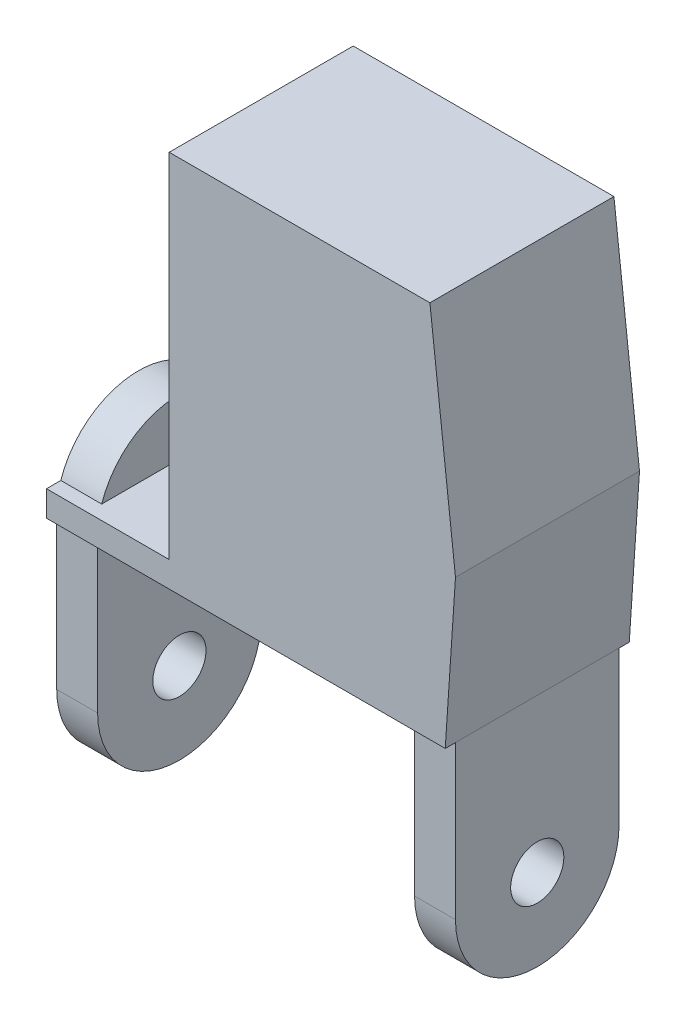
ISO-10303-21;
HEADER;
FILE_DESCRIPTION(('STEP AP214'),'2;1');
FILE_NAME('part.step','',(''),(''),'','','');
FILE_SCHEMA(('AUTOMOTIVE_DESIGN { 1 0 10303 214 1 1 1 1 }'));
ENDSEC;
DATA;
#1=APPLICATION_CONTEXT('core data for automotive mechanical design processes');
#2=APPLICATION_PROTOCOL_DEFINITION('international standard','automotive_design',2000,#1);
#3=PRODUCT_CONTEXT('',#1,'mechanical');
#4=PRODUCT('Part','Part','',(#3));
#5=PRODUCT_RELATED_PRODUCT_CATEGORY('part','',(#4));
#6=PRODUCT_DEFINITION_FORMATION('','',#4);
#7=PRODUCT_DEFINITION_CONTEXT('part definition',#1,'design');
#8=PRODUCT_DEFINITION('design','',#6,#7);
#9=PRODUCT_DEFINITION_SHAPE('','',#8);
#10=(LENGTH_UNIT() NAMED_UNIT(*) SI_UNIT(.MILLI.,.METRE.));
#11=(NAMED_UNIT(*) PLANE_ANGLE_UNIT() SI_UNIT($,.RADIAN.));
#12=(NAMED_UNIT(*) SI_UNIT($,.STERADIAN.) SOLID_ANGLE_UNIT());
#13=UNCERTAINTY_MEASURE_WITH_UNIT(LENGTH_MEASURE(1.E-05),#10,'distance_accuracy_value','');
#14=(GEOMETRIC_REPRESENTATION_CONTEXT(3) GLOBAL_UNCERTAINTY_ASSIGNED_CONTEXT((#13)) GLOBAL_UNIT_ASSIGNED_CONTEXT((#10,
#11,#12)) REPRESENTATION_CONTEXT('',''));
#15=CARTESIAN_POINT('',(0.,0.,0.));
#16=DIRECTION('',(0.,0.,1.));
#17=DIRECTION('',(1.,0.,0.));
#18=AXIS2_PLACEMENT_3D('',#15,#16,#17);
#19=CARTESIAN_POINT('',(19.5,15.,9.));
#20=DIRECTION('',(0.,1.,0.));
#21=DIRECTION('',(0.,0.,1.));
#22=AXIS2_PLACEMENT_3D('',#19,#20,#21);
#23=PLANE('',#22);
#24=DIRECTION('',(-1.,0.,0.));
#25=VECTOR('',#24,1.);
#26=CARTESIAN_POINT('',(19.5,15.,8.));
#27=LINE('',#26,#25);
#28=CARTESIAN_POINT('',(19.5,15.,8.));
#29=VERTEX_POINT('',#28);
#30=CARTESIAN_POINT('',(15.5,15.,8.));
#31=VERTEX_POINT('',#30);
#32=EDGE_CURVE('E169',#29,#31,#27,.T.);
#33=ORIENTED_EDGE('',*,*,#32,.F.);
#34=DIRECTION('',(0.,0.,-1.));
#35=VECTOR('',#34,1.);
#36=CARTESIAN_POINT('',(19.5,15.,9.));
#37=LINE('',#36,#35);
#38=CARTESIAN_POINT('',(19.5,15.,9.));
#39=VERTEX_POINT('',#38);
#40=EDGE_CURVE('E162',#39,#29,#37,.T.);
#41=ORIENTED_EDGE('',*,*,#40,.F.);
#42=DIRECTION('',(1.,0.,0.));
#43=VECTOR('',#42,1.);
#44=CARTESIAN_POINT('',(19.5,15.,9.));
#45=LINE('',#44,#43);
#46=CARTESIAN_POINT('',(-19.5,15.,9.));
#47=VERTEX_POINT('',#46);
#48=EDGE_CURVE('E226',#47,#39,#45,.T.);
#49=ORIENTED_EDGE('',*,*,#48,.F.);
#50=DIRECTION('',(0.,0.,-1.));
#51=VECTOR('',#50,1.);
#52=CARTESIAN_POINT('',(-19.5,15.,9.));
#53=LINE('',#52,#51);
#54=CARTESIAN_POINT('',(-19.5,15.,8.));
#55=VERTEX_POINT('',#54);
#56=EDGE_CURVE('E186',#47,#55,#53,.T.);
#57=ORIENTED_EDGE('',*,*,#56,.T.);
#58=DIRECTION('',(-1.,0.,0.));
#59=VECTOR('',#58,1.);
#60=CARTESIAN_POINT('',(-15.5,15.,8.));
#61=LINE('',#60,#59);
#62=CARTESIAN_POINT('',(-15.5,15.,8.));
#63=VERTEX_POINT('',#62);
#64=EDGE_CURVE('E240',#63,#55,#61,.T.);
#65=ORIENTED_EDGE('',*,*,#64,.F.);
#66=DIRECTION('',(0.,0.,-1.));
#67=VECTOR('',#66,1.);
#68=CARTESIAN_POINT('',(-15.5,15.,9.));
#69=LINE('',#68,#67);
#70=CARTESIAN_POINT('',(-15.5,15.,-8.));
#71=VERTEX_POINT('',#70);
#72=EDGE_CURVE('E42',#63,#71,#69,.T.);
#73=ORIENTED_EDGE('',*,*,#72,.T.);
#74=DIRECTION('',(-1.,0.,0.));
#75=VECTOR('',#74,1.);
#76=CARTESIAN_POINT('',(-15.5,15.,-8.));
#77=LINE('',#76,#75);
#78=CARTESIAN_POINT('',(-19.5,15.,-8.));
#79=VERTEX_POINT('',#78);
#80=EDGE_CURVE('E249',#71,#79,#77,.T.);
#81=ORIENTED_EDGE('',*,*,#80,.T.);
#82=CARTESIAN_POINT('',(-19.5,15.,-9.));
#83=VERTEX_POINT('',#82);
#84=EDGE_CURVE('E185',#79,#83,#53,.T.);
#85=ORIENTED_EDGE('',*,*,#84,.T.);
#86=DIRECTION('',(1.,0.,0.));
#87=VECTOR('',#86,1.);
#88=CARTESIAN_POINT('',(19.5,15.,-9.));
#89=LINE('',#88,#87);
#90=CARTESIAN_POINT('',(19.5,15.,-9.));
#91=VERTEX_POINT('',#90);
#92=EDGE_CURVE('E210',#83,#91,#89,.T.);
#93=ORIENTED_EDGE('',*,*,#92,.T.);
#94=CARTESIAN_POINT('',(19.5,15.,-8.));
#95=VERTEX_POINT('',#94);
#96=EDGE_CURVE('E163',#95,#91,#37,.T.);
#97=ORIENTED_EDGE('',*,*,#96,.F.);
#98=DIRECTION('',(-1.,0.,0.));
#99=VECTOR('',#98,1.);
#100=CARTESIAN_POINT('',(19.5,15.,-8.));
#101=LINE('',#100,#99);
#102=CARTESIAN_POINT('',(15.5,15.,-8.));
#103=VERTEX_POINT('',#102);
#104=EDGE_CURVE('E49',#95,#103,#101,.T.);
#105=ORIENTED_EDGE('',*,*,#104,.T.);
#106=DIRECTION('',(0.,0.,-1.));
#107=VECTOR('',#106,1.);
#108=CARTESIAN_POINT('',(15.5,15.,9.));
#109=LINE('',#108,#107);
#110=EDGE_CURVE('E11',#31,#103,#109,.T.);
#111=ORIENTED_EDGE('',*,*,#110,.F.);
#112=EDGE_LOOP('',(#33,#41,#49,#57,#65,#73,#81,#85,#93,#97,#105,#111));
#113=FACE_BOUND('',#112,.T.);
#114=ADVANCED_FACE('F33',(#113),#23,.F.);
#115=CARTESIAN_POINT('',(-19.5,17.5,9.));
#116=DIRECTION('',(0.,-1.,0.));
#117=DIRECTION('',(0.,0.,-1.));
#118=AXIS2_PLACEMENT_3D('',#115,#116,#117);
#119=PLANE('',#118);
#120=DIRECTION('',(-1.,0.,0.));
#121=VECTOR('',#120,1.);
#122=CARTESIAN_POINT('',(-15.5,17.5,7.59934207678533));
#123=LINE('',#122,#121);
#124=CARTESIAN_POINT('',(-19.5,17.5,7.59934207678533));
#125=VERTEX_POINT('',#124);
#126=CARTESIAN_POINT('',(-15.5,17.5,7.59934207678533));
#127=VERTEX_POINT('',#126);
#128=EDGE_CURVE('E221',#125,#127,#123,.F.);
#129=ORIENTED_EDGE('',*,*,#128,.F.);
#130=DIRECTION('',(0.,0.,-1.));
#131=VECTOR('',#130,1.);
#132=CARTESIAN_POINT('',(-19.5,17.5,9.));
#133=LINE('',#132,#131);
#134=CARTESIAN_POINT('',(-19.5,17.5,9.));
#135=VERTEX_POINT('',#134);
#136=EDGE_CURVE('E355',#135,#125,#133,.T.);
#137=ORIENTED_EDGE('',*,*,#136,.F.);
#138=DIRECTION('',(-1.,0.,0.));
#139=VECTOR('',#138,1.);
#140=CARTESIAN_POINT('',(-19.5,17.5,9.));
#141=LINE('',#140,#139);
#142=CARTESIAN_POINT('',(-7.5,17.5,9.));
#143=VERTEX_POINT('',#142);
#144=EDGE_CURVE('E230',#143,#135,#141,.T.);
#145=ORIENTED_EDGE('',*,*,#144,.F.);
#146=DIRECTION('',(0.,0.,-1.));
#147=VECTOR('',#146,1.);
#148=CARTESIAN_POINT('',(-7.5,17.5,9.));
#149=LINE('',#148,#147);
#150=CARTESIAN_POINT('',(-7.5,17.5,-9.));
#151=VERTEX_POINT('',#150);
#152=EDGE_CURVE('E352',#143,#151,#149,.T.);
#153=ORIENTED_EDGE('',*,*,#152,.T.);
#154=DIRECTION('',(-1.,0.,0.));
#155=VECTOR('',#154,1.);
#156=CARTESIAN_POINT('',(-19.5,17.5,-9.));
#157=LINE('',#156,#155);
#158=CARTESIAN_POINT('',(-19.5,17.5,-9.));
#159=VERTEX_POINT('',#158);
#160=EDGE_CURVE('E215',#151,#159,#157,.T.);
#161=ORIENTED_EDGE('',*,*,#160,.T.);
#162=CARTESIAN_POINT('',(-19.5,17.5,-7.59934207678533));
#163=VERTEX_POINT('',#162);
#164=EDGE_CURVE('E358',#163,#159,#133,.T.);
#165=ORIENTED_EDGE('',*,*,#164,.F.);
#166=DIRECTION('',(-1.,0.,0.));
#167=VECTOR('',#166,1.);
#168=CARTESIAN_POINT('',(-15.5,17.5,-7.59934207678533));
#169=LINE('',#168,#167);
#170=CARTESIAN_POINT('',(-15.5,17.5,-7.59934207678533));
#171=VERTEX_POINT('',#170);
#172=EDGE_CURVE('E235',#171,#163,#169,.T.);
#173=ORIENTED_EDGE('',*,*,#172,.F.);
#174=DIRECTION('',(0.,0.,1.));
#175=VECTOR('',#174,1.);
#176=CARTESIAN_POINT('',(-15.5,17.5,9.));
#177=LINE('',#176,#175);
#178=EDGE_CURVE('E237',#171,#127,#177,.T.);
#179=ORIENTED_EDGE('',*,*,#178,.T.);
#180=EDGE_LOOP('',(#129,#137,#145,#153,#161,#165,#173,#179));
#181=FACE_BOUND('',#180,.T.);
#182=ADVANCED_FACE('F311',(#181),#119,.F.);
#183=CARTESIAN_POINT('',(-7.5,17.5,9.));
#184=DIRECTION('',(1.,0.,0.));
#185=DIRECTION('',(0.,0.,-1.));
#186=AXIS2_PLACEMENT_3D('',#183,#184,#185);
#187=PLANE('',#186);
#188=DIRECTION('',(0.,-1.,0.));
#189=VECTOR('',#188,1.);
#190=CARTESIAN_POINT('',(-7.5,17.5,-9.));
#191=LINE('',#190,#189);
#192=CARTESIAN_POINT('',(-7.5,52.,-9.));
#193=VERTEX_POINT('',#192);
#194=EDGE_CURVE('E218',#193,#151,#191,.T.);
#195=ORIENTED_EDGE('',*,*,#194,.T.);
#196=ORIENTED_EDGE('',*,*,#152,.F.);
#197=DIRECTION('',(0.,-1.,0.));
#198=VECTOR('',#197,1.);
#199=CARTESIAN_POINT('',(-7.5,17.5,9.));
#200=LINE('',#199,#198);
#201=CARTESIAN_POINT('',(-7.5,52.,9.));
#202=VERTEX_POINT('',#201);
#203=EDGE_CURVE('E205',#202,#143,#200,.T.);
#204=ORIENTED_EDGE('',*,*,#203,.F.);
#205=DIRECTION('',(0.,0.,-1.));
#206=VECTOR('',#205,1.);
#207=CARTESIAN_POINT('',(-7.5,52.,9.));
#208=LINE('',#207,#206);
#209=EDGE_CURVE('E197',#202,#193,#208,.T.);
#210=ORIENTED_EDGE('',*,*,#209,.T.);
#211=EDGE_LOOP('',(#195,#196,#204,#210));
#212=FACE_BOUND('',#211,.T.);
#213=ADVANCED_FACE('F35',(#212),#187,.F.);
#214=CARTESIAN_POINT('',(-19.5,15.,9.));
#215=DIRECTION('',(1.,0.,0.));
#216=DIRECTION('',(0.,0.,-1.));
#217=AXIS2_PLACEMENT_3D('',#214,#215,#216);
#218=PLANE('',#217);
#219=CARTESIAN_POINT('',(-19.5,0.,0.));
#220=DIRECTION('',(1.,0.,0.));
#221=DIRECTION('',(0.,0.,-1.));
#222=AXIS2_PLACEMENT_3D('',#219,#220,#221);
#223=CIRCLE('',#222,2.6);
#224=CARTESIAN_POINT('',(-19.5,0.,-2.6));
#225=VERTEX_POINT('',#224);
#226=EDGE_CURVE('E280',#225,#225,#223,.T.);
#227=ORIENTED_EDGE('',*,*,#226,.T.);
#228=EDGE_LOOP('',(#227));
#229=FACE_BOUND('',#228,.T.);
#230=ORIENTED_EDGE('',*,*,#84,.F.);
#231=DIRECTION('',(0.,1.,0.));
#232=VECTOR('',#231,1.);
#233=CARTESIAN_POINT('',(-19.5,15.,-8.));
#234=LINE('',#233,#232);
#235=CARTESIAN_POINT('',(-19.5,0.,-8.));
#236=VERTEX_POINT('',#235);
#237=EDGE_CURVE('E253',#236,#79,#234,.T.);
#238=ORIENTED_EDGE('',*,*,#237,.F.);
#239=CARTESIAN_POINT('',(-19.5,0.,0.));
#240=DIRECTION('',(1.,0.,0.));
#241=DIRECTION('',(0.,0.,-1.));
#242=AXIS2_PLACEMENT_3D('',#239,#240,#241);
#243=CIRCLE('',#242,8.);
#244=CARTESIAN_POINT('',(-19.5,0.,8.));
#245=VERTEX_POINT('',#244);
#246=EDGE_CURVE('E257',#245,#236,#243,.T.);
#247=ORIENTED_EDGE('',*,*,#246,.F.);
#248=DIRECTION('',(0.,-1.,0.));
#249=VECTOR('',#248,1.);
#250=CARTESIAN_POINT('',(-19.5,15.,8.));
#251=LINE('',#250,#249);
#252=EDGE_CURVE('E259',#55,#245,#251,.T.);
#253=ORIENTED_EDGE('',*,*,#252,.F.);
#254=ORIENTED_EDGE('',*,*,#56,.F.);
#255=DIRECTION('',(0.,-1.,0.));
#256=VECTOR('',#255,1.);
#257=CARTESIAN_POINT('',(-19.5,15.,9.));
#258=LINE('',#257,#256);
#259=EDGE_CURVE('E228',#135,#47,#258,.T.);
#260=ORIENTED_EDGE('',*,*,#259,.F.);
#261=ORIENTED_EDGE('',*,*,#136,.T.);
#262=CARTESIAN_POINT('',(-19.5,15.,0.));
#263=DIRECTION('',(1.,0.,0.));
#264=DIRECTION('',(0.,0.,-1.));
#265=AXIS2_PLACEMENT_3D('',#262,#263,#264);
#266=CIRCLE('',#265,8.);
#267=EDGE_CURVE('E57',#163,#125,#266,.T.);
#268=ORIENTED_EDGE('',*,*,#267,.F.);
#269=ORIENTED_EDGE('',*,*,#164,.T.);
#270=DIRECTION('',(0.,-1.,0.));
#271=VECTOR('',#270,1.);
#272=CARTESIAN_POINT('',(-19.5,15.,-9.));
#273=LINE('',#272,#271);
#274=EDGE_CURVE('E212',#159,#83,#273,.T.);
#275=ORIENTED_EDGE('',*,*,#274,.T.);
#276=EDGE_LOOP('',(#230,#238,#247,#253,#254,#260,#261,#268,#269,#275));
#277=FACE_BOUND('',#276,.T.);
#278=ADVANCED_FACE('F320',(#229,#277),#218,.F.);
#279=CARTESIAN_POINT('',(20.5,30.,9.));
#280=DIRECTION('',(-0.997785157856609,0.066519010523774,0.));
#281=DIRECTION('',(-0.066519010523774,-0.997785157856609,0.));
#282=AXIS2_PLACEMENT_3D('',#279,#280,#281);
#283=PLANE('',#282);
#284=DIRECTION('',(0.066519010523774,0.997785157856609,0.));
#285=VECTOR('',#284,1.);
#286=CARTESIAN_POINT('',(20.5,30.,-9.));
#287=LINE('',#286,#285);
#288=CARTESIAN_POINT('',(20.5,30.,-9.));
#289=VERTEX_POINT('',#288);
#290=EDGE_CURVE('E208',#91,#289,#287,.T.);
#291=ORIENTED_EDGE('',*,*,#290,.T.);
#292=DIRECTION('',(0.,0.,-1.));
#293=VECTOR('',#292,1.);
#294=CARTESIAN_POINT('',(20.5,30.,9.));
#295=LINE('',#294,#293);
#296=CARTESIAN_POINT('',(20.5,30.,9.));
#297=VERTEX_POINT('',#296);
#298=EDGE_CURVE('E189',#297,#289,#295,.T.);
#299=ORIENTED_EDGE('',*,*,#298,.F.);
#300=DIRECTION('',(0.066519010523774,0.997785157856609,0.));
#301=VECTOR('',#300,1.);
#302=CARTESIAN_POINT('',(20.5,30.,9.));
#303=LINE('',#302,#301);
#304=EDGE_CURVE('E184',#39,#297,#303,.T.);
#305=ORIENTED_EDGE('',*,*,#304,.F.);
#306=ORIENTED_EDGE('',*,*,#40,.T.);
#307=EDGE_CURVE('E153',#29,#95,#37,.T.);
#308=ORIENTED_EDGE('',*,*,#307,.T.);
#309=ORIENTED_EDGE('',*,*,#96,.T.);
#310=EDGE_LOOP('',(#291,#299,#305,#306,#308,#309));
#311=FACE_BOUND('',#310,.T.);
#312=ADVANCED_FACE('F182',(#311),#283,.F.);
#313=CARTESIAN_POINT('',(18.,52.,9.));
#314=DIRECTION('',(-0.993605254789719,-0.112909688044286,0.));
#315=DIRECTION('',(0.112909688044286,-0.993605254789719,0.));
#316=AXIS2_PLACEMENT_3D('',#313,#314,#315);
#317=PLANE('',#316);
#318=DIRECTION('',(-0.112909688044286,0.993605254789719,0.));
#319=VECTOR('',#318,1.);
#320=CARTESIAN_POINT('',(18.,52.,-9.));
#321=LINE('',#320,#319);
#322=CARTESIAN_POINT('',(18.,52.,-9.));
#323=VERTEX_POINT('',#322);
#324=EDGE_CURVE('E206',#289,#323,#321,.T.);
#325=ORIENTED_EDGE('',*,*,#324,.T.);
#326=DIRECTION('',(0.,0.,-1.));
#327=VECTOR('',#326,1.);
#328=CARTESIAN_POINT('',(18.,52.,9.));
#329=LINE('',#328,#327);
#330=CARTESIAN_POINT('',(18.,52.,9.));
#331=VERTEX_POINT('',#330);
#332=EDGE_CURVE('E192',#331,#323,#329,.T.);
#333=ORIENTED_EDGE('',*,*,#332,.F.);
#334=DIRECTION('',(-0.112909688044286,0.993605254789719,0.));
#335=VECTOR('',#334,1.);
#336=CARTESIAN_POINT('',(18.,52.,9.));
#337=LINE('',#336,#335);
#338=EDGE_CURVE('E223',#297,#331,#337,.T.);
#339=ORIENTED_EDGE('',*,*,#338,.F.);
#340=ORIENTED_EDGE('',*,*,#298,.T.);
#341=EDGE_LOOP('',(#325,#333,#339,#340));
#342=FACE_BOUND('',#341,.T.);
#343=ADVANCED_FACE('F327',(#342),#317,.F.);
#344=CARTESIAN_POINT('',(-7.5,52.,9.));
#345=DIRECTION('',(0.,-1.,0.));
#346=DIRECTION('',(0.,0.,-1.));
#347=AXIS2_PLACEMENT_3D('',#344,#345,#346);
#348=PLANE('',#347);
#349=DIRECTION('',(-1.,0.,0.));
#350=VECTOR('',#349,1.);
#351=CARTESIAN_POINT('',(-7.5,52.,-9.));
#352=LINE('',#351,#350);
#353=EDGE_CURVE('E203',#323,#193,#352,.T.);
#354=ORIENTED_EDGE('',*,*,#353,.T.);
#355=ORIENTED_EDGE('',*,*,#209,.F.);
#356=DIRECTION('',(-1.,0.,0.));
#357=VECTOR('',#356,1.);
#358=CARTESIAN_POINT('',(-7.5,52.,9.));
#359=LINE('',#358,#357);
#360=EDGE_CURVE('E202',#331,#202,#359,.T.);
#361=ORIENTED_EDGE('',*,*,#360,.F.);
#362=ORIENTED_EDGE('',*,*,#332,.T.);
#363=EDGE_LOOP('',(#354,#355,#361,#362));
#364=FACE_BOUND('',#363,.T.);
#365=ADVANCED_FACE('F490',(#364),#348,.F.);
#366=CARTESIAN_POINT('',(0.,0.,9.));
#367=DIRECTION('',(0.,0.,-1.));
#368=DIRECTION('',(-1.,0.,0.));
#369=AXIS2_PLACEMENT_3D('',#366,#367,#368);
#370=PLANE('',#369);
#371=ORIENTED_EDGE('',*,*,#203,.T.);
#372=ORIENTED_EDGE('',*,*,#144,.T.);
#373=ORIENTED_EDGE('',*,*,#259,.T.);
#374=ORIENTED_EDGE('',*,*,#48,.T.);
#375=ORIENTED_EDGE('',*,*,#304,.T.);
#376=ORIENTED_EDGE('',*,*,#338,.T.);
#377=ORIENTED_EDGE('',*,*,#360,.T.);
#378=EDGE_LOOP('',(#371,#372,#373,#374,#375,#376,#377));
#379=FACE_BOUND('',#378,.T.);
#380=ADVANCED_FACE('F371',(#379),#370,.F.);
#381=CARTESIAN_POINT('',(0.,0.,-9.));
#382=DIRECTION('',(0.,0.,-1.));
#383=DIRECTION('',(-1.,0.,0.));
#384=AXIS2_PLACEMENT_3D('',#381,#382,#383);
#385=PLANE('',#384);
#386=ORIENTED_EDGE('',*,*,#194,.F.);
#387=ORIENTED_EDGE('',*,*,#353,.F.);
#388=ORIENTED_EDGE('',*,*,#324,.F.);
#389=ORIENTED_EDGE('',*,*,#290,.F.);
#390=ORIENTED_EDGE('',*,*,#92,.F.);
#391=ORIENTED_EDGE('',*,*,#274,.F.);
#392=ORIENTED_EDGE('',*,*,#160,.F.);
#393=EDGE_LOOP('',(#386,#387,#388,#389,#390,#391,#392));
#394=FACE_BOUND('',#393,.T.);
#395=ADVANCED_FACE('F365',(#394),#385,.T.);
#396=CARTESIAN_POINT('',(-15.5,15.,-8.));
#397=DIRECTION('',(0.,0.,1.));
#398=DIRECTION('',(1.,0.,0.));
#399=AXIS2_PLACEMENT_3D('',#396,#397,#398);
#400=PLANE('',#399);
#401=ORIENTED_EDGE('',*,*,#237,.T.);
#402=ORIENTED_EDGE('',*,*,#80,.F.);
#403=DIRECTION('',(0.,1.,0.));
#404=VECTOR('',#403,1.);
#405=CARTESIAN_POINT('',(-15.5,15.,-8.));
#406=LINE('',#405,#404);
#407=CARTESIAN_POINT('',(-15.5,0.,-8.));
#408=VERTEX_POINT('',#407);
#409=EDGE_CURVE('E252',#408,#71,#406,.T.);
#410=ORIENTED_EDGE('',*,*,#409,.F.);
#411=DIRECTION('',(-1.,0.,0.));
#412=VECTOR('',#411,1.);
#413=CARTESIAN_POINT('',(-15.5,0.,-8.));
#414=LINE('',#413,#412);
#415=EDGE_CURVE('E246',#408,#236,#414,.T.);
#416=ORIENTED_EDGE('',*,*,#415,.T.);
#417=EDGE_LOOP('',(#401,#402,#410,#416));
#418=FACE_BOUND('',#417,.T.);
#419=ADVANCED_FACE('F338',(#418),#400,.F.);
#420=CARTESIAN_POINT('',(-15.5,0.,0.));
#421=DIRECTION('',(-1.,0.,0.));
#422=DIRECTION('',(0.,0.,1.));
#423=AXIS2_PLACEMENT_3D('',#420,#421,#422);
#424=CYLINDRICAL_SURFACE('',#423,8.);
#425=ORIENTED_EDGE('',*,*,#246,.T.);
#426=ORIENTED_EDGE('',*,*,#415,.F.);
#427=CARTESIAN_POINT('',(-15.5,0.,0.));
#428=DIRECTION('',(1.,0.,0.));
#429=DIRECTION('',(0.,0.,-1.));
#430=AXIS2_PLACEMENT_3D('',#427,#428,#429);
#431=CIRCLE('',#430,8.);
#432=CARTESIAN_POINT('',(-15.5,0.,8.));
#433=VERTEX_POINT('',#432);
#434=EDGE_CURVE('E264',#433,#408,#431,.T.);
#435=ORIENTED_EDGE('',*,*,#434,.F.);
#436=DIRECTION('',(-1.,0.,0.));
#437=VECTOR('',#436,1.);
#438=CARTESIAN_POINT('',(-15.5,0.,8.));
#439=LINE('',#438,#437);
#440=EDGE_CURVE('E243',#433,#245,#439,.T.);
#441=ORIENTED_EDGE('',*,*,#440,.T.);
#442=EDGE_LOOP('',(#425,#426,#435,#441));
#443=FACE_BOUND('',#442,.T.);
#444=ADVANCED_FACE('F342',(#443),#424,.T.);
#445=CARTESIAN_POINT('',(-15.5,15.,8.));
#446=DIRECTION('',(0.,0.,-1.));
#447=DIRECTION('',(-1.,0.,0.));
#448=AXIS2_PLACEMENT_3D('',#445,#446,#447);
#449=PLANE('',#448);
#450=ORIENTED_EDGE('',*,*,#252,.T.);
#451=ORIENTED_EDGE('',*,*,#440,.F.);
#452=DIRECTION('',(0.,-1.,0.));
#453=VECTOR('',#452,1.);
#454=CARTESIAN_POINT('',(-15.5,15.,8.));
#455=LINE('',#454,#453);
#456=EDGE_CURVE('E266',#63,#433,#455,.T.);
#457=ORIENTED_EDGE('',*,*,#456,.F.);
#458=ORIENTED_EDGE('',*,*,#64,.T.);
#459=EDGE_LOOP('',(#450,#451,#457,#458));
#460=FACE_BOUND('',#459,.T.);
#461=ADVANCED_FACE('F349',(#460),#449,.F.);
#462=CARTESIAN_POINT('',(-15.5,15.,0.));
#463=DIRECTION('',(1.,0.,0.));
#464=DIRECTION('',(0.,0.,-1.));
#465=AXIS2_PLACEMENT_3D('',#462,#463,#464);
#466=PLANE('',#465);
#467=CARTESIAN_POINT('',(-15.5,0.,0.));
#468=DIRECTION('',(1.,0.,0.));
#469=DIRECTION('',(0.,0.,-1.));
#470=AXIS2_PLACEMENT_3D('',#467,#468,#469);
#471=CIRCLE('',#470,2.6);
#472=CARTESIAN_POINT('',(-15.5,0.,-2.6));
#473=VERTEX_POINT('',#472);
#474=EDGE_CURVE('E285',#473,#473,#471,.T.);
#475=ORIENTED_EDGE('',*,*,#474,.F.);
#476=EDGE_LOOP('',(#475));
#477=FACE_BOUND('',#476,.T.);
#478=ORIENTED_EDGE('',*,*,#72,.F.);
#479=ORIENTED_EDGE('',*,*,#456,.T.);
#480=ORIENTED_EDGE('',*,*,#434,.T.);
#481=ORIENTED_EDGE('',*,*,#409,.T.);
#482=EDGE_LOOP('',(#478,#479,#480,#481));
#483=FACE_BOUND('',#482,.T.);
#484=ADVANCED_FACE('F351',(#477,#483),#466,.T.);
#485=CARTESIAN_POINT('',(-15.5,15.,0.));
#486=DIRECTION('',(-1.,0.,0.));
#487=DIRECTION('',(0.,0.,1.));
#488=AXIS2_PLACEMENT_3D('',#485,#486,#487);
#489=CYLINDRICAL_SURFACE('',#488,8.);
#490=ORIENTED_EDGE('',*,*,#267,.T.);
#491=ORIENTED_EDGE('',*,*,#128,.T.);
#492=CARTESIAN_POINT('',(-15.5,15.,0.));
#493=DIRECTION('',(1.,0.,0.));
#494=DIRECTION('',(0.,0.,-1.));
#495=AXIS2_PLACEMENT_3D('',#492,#493,#494);
#496=CIRCLE('',#495,8.);
#497=EDGE_CURVE('E256',#171,#127,#496,.T.);
#498=ORIENTED_EDGE('',*,*,#497,.F.);
#499=ORIENTED_EDGE('',*,*,#172,.T.);
#500=EDGE_LOOP('',(#490,#491,#498,#499));
#501=FACE_BOUND('',#500,.T.);
#502=ADVANCED_FACE('F376',(#501),#489,.T.);
#503=ORIENTED_EDGE('',*,*,#178,.F.);
#504=ORIENTED_EDGE('',*,*,#497,.T.);
#505=EDGE_LOOP('',(#503,#504));
#506=FACE_BOUND('',#505,.T.);
#507=ADVANCED_FACE('F307',(#506),#466,.T.);
#508=CARTESIAN_POINT('',(15.5,15.,0.));
#509=DIRECTION('',(1.,0.,0.));
#510=DIRECTION('',(0.,0.,-1.));
#511=AXIS2_PLACEMENT_3D('',#508,#509,#510);
#512=PLANE('',#511);
#513=CARTESIAN_POINT('',(15.5000000000001,0.,0.));
#514=DIRECTION('',(1.,0.,0.));
#515=DIRECTION('',(0.,0.,-1.));
#516=AXIS2_PLACEMENT_3D('',#513,#514,#515);
#517=CIRCLE('',#516,2.6);
#518=CARTESIAN_POINT('',(15.5000000000001,0.,-2.6));
#519=VERTEX_POINT('',#518);
#520=EDGE_CURVE('E288',#519,#519,#517,.T.);
#521=ORIENTED_EDGE('',*,*,#520,.T.);
#522=EDGE_LOOP('',(#521));
#523=FACE_BOUND('',#522,.T.);
#524=DIRECTION('',(0.,-1.,0.));
#525=VECTOR('',#524,1.);
#526=CARTESIAN_POINT('',(15.5,15.,8.));
#527=LINE('',#526,#525);
#528=CARTESIAN_POINT('',(15.5,0.,8.));
#529=VERTEX_POINT('',#528);
#530=EDGE_CURVE('E278',#31,#529,#527,.T.);
#531=ORIENTED_EDGE('',*,*,#530,.F.);
#532=ORIENTED_EDGE('',*,*,#110,.T.);
#533=DIRECTION('',(0.,1.,0.));
#534=VECTOR('',#533,1.);
#535=CARTESIAN_POINT('',(15.5,15.,-8.));
#536=LINE('',#535,#534);
#537=CARTESIAN_POINT('',(15.5,0.,-8.));
#538=VERTEX_POINT('',#537);
#539=EDGE_CURVE('E175',#538,#103,#536,.T.);
#540=ORIENTED_EDGE('',*,*,#539,.F.);
#541=CARTESIAN_POINT('',(15.5,0.,0.));
#542=DIRECTION('',(1.,0.,0.));
#543=DIRECTION('',(0.,0.,-1.));
#544=AXIS2_PLACEMENT_3D('',#541,#542,#543);
#545=CIRCLE('',#544,8.);
#546=EDGE_CURVE('E276',#529,#538,#545,.T.);
#547=ORIENTED_EDGE('',*,*,#546,.F.);
#548=EDGE_LOOP('',(#531,#532,#540,#547));
#549=FACE_BOUND('',#548,.T.);
#550=ADVANCED_FACE('F299',(#523,#549),#512,.F.);
#551=CARTESIAN_POINT('',(19.5,15.,0.));
#552=DIRECTION('',(1.,0.,0.));
#553=DIRECTION('',(0.,0.,-1.));
#554=AXIS2_PLACEMENT_3D('',#551,#552,#553);
#555=PLANE('',#554);
#556=CARTESIAN_POINT('',(19.5000000000001,0.,0.));
#557=DIRECTION('',(1.,0.,0.));
#558=DIRECTION('',(0.,0.,-1.));
#559=AXIS2_PLACEMENT_3D('',#556,#557,#558);
#560=CIRCLE('',#559,2.6);
#561=CARTESIAN_POINT('',(19.5000000000001,0.,-2.6));
#562=VERTEX_POINT('',#561);
#563=EDGE_CURVE('E37',#562,#562,#560,.T.);
#564=ORIENTED_EDGE('',*,*,#563,.F.);
#565=EDGE_LOOP('',(#564));
#566=FACE_BOUND('',#565,.T.);
#567=ORIENTED_EDGE('',*,*,#307,.F.);
#568=DIRECTION('',(0.,-1.,0.));
#569=VECTOR('',#568,1.);
#570=CARTESIAN_POINT('',(19.5,15.,8.));
#571=LINE('',#570,#569);
#572=CARTESIAN_POINT('',(19.5,0.,8.));
#573=VERTEX_POINT('',#572);
#574=EDGE_CURVE('E156',#29,#573,#571,.T.);
#575=ORIENTED_EDGE('',*,*,#574,.T.);
#576=CARTESIAN_POINT('',(19.5,0.,0.));
#577=DIRECTION('',(1.,0.,0.));
#578=DIRECTION('',(0.,0.,-1.));
#579=AXIS2_PLACEMENT_3D('',#576,#577,#578);
#580=CIRCLE('',#579,8.);
#581=CARTESIAN_POINT('',(19.5,0.,-8.));
#582=VERTEX_POINT('',#581);
#583=EDGE_CURVE('E174',#573,#582,#580,.T.);
#584=ORIENTED_EDGE('',*,*,#583,.T.);
#585=DIRECTION('',(0.,1.,0.));
#586=VECTOR('',#585,1.);
#587=CARTESIAN_POINT('',(19.5,15.,-8.));
#588=LINE('',#587,#586);
#589=EDGE_CURVE('E158',#582,#95,#588,.T.);
#590=ORIENTED_EDGE('',*,*,#589,.T.);
#591=EDGE_LOOP('',(#567,#575,#584,#590));
#592=FACE_BOUND('',#591,.T.);
#593=ADVANCED_FACE('F155',(#566,#592),#555,.T.);
#594=CARTESIAN_POINT('',(19.5,15.,8.));
#595=DIRECTION('',(0.,0.,-1.));
#596=DIRECTION('',(-1.,0.,0.));
#597=AXIS2_PLACEMENT_3D('',#594,#595,#596);
#598=PLANE('',#597);
#599=ORIENTED_EDGE('',*,*,#530,.T.);
#600=DIRECTION('',(-1.,0.,0.));
#601=VECTOR('',#600,1.);
#602=CARTESIAN_POINT('',(19.5,0.,8.));
#603=LINE('',#602,#601);
#604=EDGE_CURVE('E172',#573,#529,#603,.T.);
#605=ORIENTED_EDGE('',*,*,#604,.F.);
#606=ORIENTED_EDGE('',*,*,#574,.F.);
#607=ORIENTED_EDGE('',*,*,#32,.T.);
#608=EDGE_LOOP('',(#599,#605,#606,#607));
#609=FACE_BOUND('',#608,.T.);
#610=ADVANCED_FACE('F168',(#609),#598,.F.);
#611=CARTESIAN_POINT('',(19.5,0.,0.));
#612=DIRECTION('',(-1.,0.,0.));
#613=DIRECTION('',(0.,0.,1.));
#614=AXIS2_PLACEMENT_3D('',#611,#612,#613);
#615=CYLINDRICAL_SURFACE('',#614,8.);
#616=ORIENTED_EDGE('',*,*,#546,.T.);
#617=DIRECTION('',(-1.,0.,0.));
#618=VECTOR('',#617,1.);
#619=CARTESIAN_POINT('',(19.5,0.,-8.));
#620=LINE('',#619,#618);
#621=EDGE_CURVE('E271',#582,#538,#620,.T.);
#622=ORIENTED_EDGE('',*,*,#621,.F.);
#623=ORIENTED_EDGE('',*,*,#583,.F.);
#624=ORIENTED_EDGE('',*,*,#604,.T.);
#625=EDGE_LOOP('',(#616,#622,#623,#624));
#626=FACE_BOUND('',#625,.T.);
#627=ADVANCED_FACE('F305',(#626),#615,.T.);
#628=CARTESIAN_POINT('',(19.5,15.,-8.));
#629=DIRECTION('',(0.,0.,1.));
#630=DIRECTION('',(1.,0.,0.));
#631=AXIS2_PLACEMENT_3D('',#628,#629,#630);
#632=PLANE('',#631);
#633=ORIENTED_EDGE('',*,*,#539,.T.);
#634=ORIENTED_EDGE('',*,*,#104,.F.);
#635=ORIENTED_EDGE('',*,*,#589,.F.);
#636=ORIENTED_EDGE('',*,*,#621,.T.);
#637=EDGE_LOOP('',(#633,#634,#635,#636));
#638=FACE_BOUND('',#637,.T.);
#639=ADVANCED_FACE('F399',(#638),#632,.F.);
#640=CARTESIAN_POINT('',(-1000.,0.,0.));
#641=DIRECTION('',(1.,0.,0.));
#642=DIRECTION('',(0.,0.,-1.));
#643=AXIS2_PLACEMENT_3D('',#640,#641,#642);
#644=CYLINDRICAL_SURFACE('',#643,2.6);
#645=ORIENTED_EDGE('',*,*,#563,.T.);
#646=EDGE_LOOP('',(#645));
#647=FACE_BOUND('',#646,.T.);
#648=ORIENTED_EDGE('',*,*,#520,.F.);
#649=EDGE_LOOP('',(#648));
#650=FACE_BOUND('',#649,.T.);
#651=ADVANCED_FACE('F295',(#647,#650),#644,.F.);
#652=ORIENTED_EDGE('',*,*,#474,.T.);
#653=EDGE_LOOP('',(#652));
#654=FACE_BOUND('',#653,.T.);
#655=ORIENTED_EDGE('',*,*,#226,.F.);
#656=EDGE_LOOP('',(#655));
#657=FACE_BOUND('',#656,.T.);
#658=ADVANCED_FACE('F393',(#654,#657),#644,.F.);
#659=CLOSED_SHELL('',(#114,#182,#213,#278,#312,#343,#365,#380,#395,#419,#444,#461,#484,#502,
#507,#550,#593,#610,#627,#639,#651,#658));
#660=MANIFOLD_SOLID_BREP('B2',#659);
#661=ADVANCED_BREP_SHAPE_REPRESENTATION('',(#18,#660),#14);
#662=SHAPE_DEFINITION_REPRESENTATION(#9,#661);
ENDSEC;
END-ISO-10303-21;
